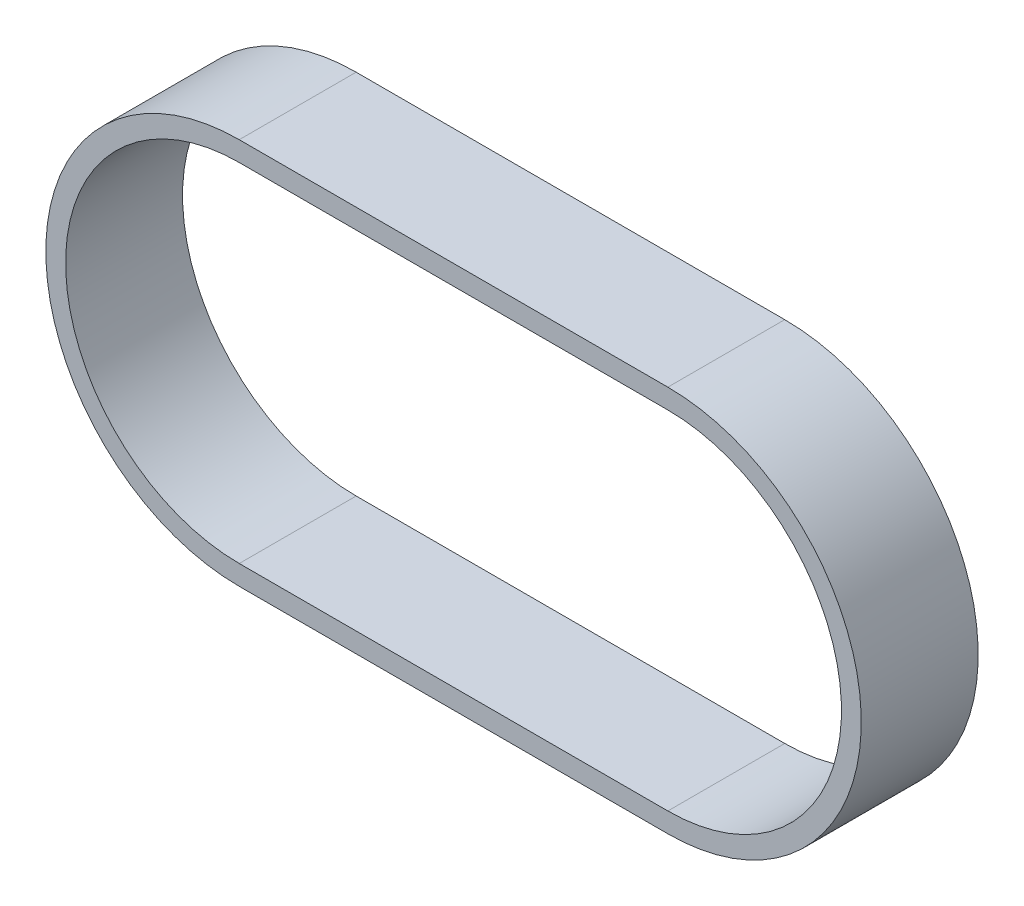
ISO-10303-21;
HEADER;
FILE_DESCRIPTION(('STEP AP214'),'2;1');
FILE_NAME('part.step','',(''),(''),'','','');
FILE_SCHEMA(('AUTOMOTIVE_DESIGN { 1 0 10303 214 1 1 1 1 }'));
ENDSEC;
DATA;
#1=APPLICATION_CONTEXT('core data for automotive mechanical design processes');
#2=APPLICATION_PROTOCOL_DEFINITION('international standard','automotive_design',2000,#1);
#3=PRODUCT_CONTEXT('',#1,'mechanical');
#4=PRODUCT('Part','Part','',(#3));
#5=PRODUCT_RELATED_PRODUCT_CATEGORY('part','',(#4));
#6=PRODUCT_DEFINITION_FORMATION('','',#4);
#7=PRODUCT_DEFINITION_CONTEXT('part definition',#1,'design');
#8=PRODUCT_DEFINITION('design','',#6,#7);
#9=PRODUCT_DEFINITION_SHAPE('','',#8);
#10=(LENGTH_UNIT() NAMED_UNIT(*) SI_UNIT(.MILLI.,.METRE.));
#11=(NAMED_UNIT(*) PLANE_ANGLE_UNIT() SI_UNIT($,.RADIAN.));
#12=(NAMED_UNIT(*) SI_UNIT($,.STERADIAN.) SOLID_ANGLE_UNIT());
#13=UNCERTAINTY_MEASURE_WITH_UNIT(LENGTH_MEASURE(1.E-05),#10,'distance_accuracy_value','');
#14=(GEOMETRIC_REPRESENTATION_CONTEXT(3) GLOBAL_UNCERTAINTY_ASSIGNED_CONTEXT((#13)) GLOBAL_UNIT_ASSIGNED_CONTEXT((#10,
#11,#12)) REPRESENTATION_CONTEXT('',''));
#15=CARTESIAN_POINT('',(0.,0.,0.));
#16=DIRECTION('',(0.,0.,1.));
#17=DIRECTION('',(1.,0.,0.));
#18=AXIS2_PLACEMENT_3D('',#15,#16,#17);
#19=CARTESIAN_POINT('',(0.,0.,15.));
#20=DIRECTION('',(0.,0.,-1.));
#21=DIRECTION('',(-1.,0.,0.));
#22=AXIS2_PLACEMENT_3D('',#19,#20,#21);
#23=PLANE('',#22);
#24=CARTESIAN_POINT('',(0.,0.,15.));
#25=DIRECTION('',(0.,0.,1.));
#26=DIRECTION('',(-1.,0.,0.));
#27=AXIS2_PLACEMENT_3D('',#24,#25,#26);
#28=CIRCLE('',#27,24.8158);
#29=CARTESIAN_POINT('',(0.,24.8158,15.));
#30=VERTEX_POINT('',#29);
#31=CARTESIAN_POINT('',(0.,-24.8158,15.));
#32=VERTEX_POINT('',#31);
#33=EDGE_CURVE('E140',#30,#32,#28,.T.);
#34=ORIENTED_EDGE('',*,*,#33,.T.);
#35=DIRECTION('',(1.,0.,0.));
#36=VECTOR('',#35,1.);
#37=CARTESIAN_POINT('',(54.991,-24.8158,15.));
#38=LINE('',#37,#36);
#39=CARTESIAN_POINT('',(54.991,-24.8158,15.));
#40=VERTEX_POINT('',#39);
#41=EDGE_CURVE('E143',#32,#40,#38,.T.);
#42=ORIENTED_EDGE('',*,*,#41,.T.);
#43=CARTESIAN_POINT('',(54.991,0.,15.));
#44=DIRECTION('',(0.,0.,1.));
#45=DIRECTION('',(1.,0.,0.));
#46=AXIS2_PLACEMENT_3D('',#43,#44,#45);
#47=CIRCLE('',#46,24.8158);
#48=CARTESIAN_POINT('',(54.991,24.8158,15.));
#49=VERTEX_POINT('',#48);
#50=EDGE_CURVE('E146',#40,#49,#47,.T.);
#51=ORIENTED_EDGE('',*,*,#50,.T.);
#52=DIRECTION('',(-1.,0.,0.));
#53=VECTOR('',#52,1.);
#54=CARTESIAN_POINT('',(0.,24.8158,15.));
#55=LINE('',#54,#53);
#56=EDGE_CURVE('E148',#49,#30,#55,.T.);
#57=ORIENTED_EDGE('',*,*,#56,.T.);
#58=EDGE_LOOP('',(#34,#42,#51,#57));
#59=FACE_BOUND('',#58,.T.);
#60=CARTESIAN_POINT('',(0.,0.,15.));
#61=DIRECTION('',(0.,0.,1.));
#62=DIRECTION('',(-1.,0.,0.));
#63=AXIS2_PLACEMENT_3D('',#60,#61,#62);
#64=CIRCLE('',#63,22.2758);
#65=CARTESIAN_POINT('',(0.,22.2758,15.));
#66=VERTEX_POINT('',#65);
#67=CARTESIAN_POINT('',(0.,-22.2758,15.));
#68=VERTEX_POINT('',#67);
#69=EDGE_CURVE('E104',#66,#68,#64,.T.);
#70=ORIENTED_EDGE('',*,*,#69,.F.);
#71=DIRECTION('',(-1.,0.,0.));
#72=VECTOR('',#71,1.);
#73=CARTESIAN_POINT('',(0.,22.2758,15.));
#74=LINE('',#73,#72);
#75=CARTESIAN_POINT('',(54.991,22.2758,15.));
#76=VERTEX_POINT('',#75);
#77=EDGE_CURVE('E126',#76,#66,#74,.T.);
#78=ORIENTED_EDGE('',*,*,#77,.F.);
#79=CARTESIAN_POINT('',(54.991,0.,15.));
#80=DIRECTION('',(0.,0.,1.));
#81=DIRECTION('',(1.,0.,0.));
#82=AXIS2_PLACEMENT_3D('',#79,#80,#81);
#83=CIRCLE('',#82,22.2758);
#84=CARTESIAN_POINT('',(54.991,-22.2758,15.));
#85=VERTEX_POINT('',#84);
#86=EDGE_CURVE('E124',#85,#76,#83,.T.);
#87=ORIENTED_EDGE('',*,*,#86,.F.);
#88=DIRECTION('',(1.,0.,0.));
#89=VECTOR('',#88,1.);
#90=CARTESIAN_POINT('',(54.991,-22.2758,15.));
#91=LINE('',#90,#89);
#92=EDGE_CURVE('E112',#68,#85,#91,.T.);
#93=ORIENTED_EDGE('',*,*,#92,.F.);
#94=EDGE_LOOP('',(#70,#78,#87,#93));
#95=FACE_BOUND('',#94,.T.);
#96=ADVANCED_FACE('F39',(#59,#95),#23,.F.);
#97=CARTESIAN_POINT('',(0.,0.,0.));
#98=DIRECTION('',(0.,0.,-1.));
#99=DIRECTION('',(-1.,0.,0.));
#100=AXIS2_PLACEMENT_3D('',#97,#98,#99);
#101=PLANE('',#100);
#102=CARTESIAN_POINT('',(0.,0.,0.));
#103=DIRECTION('',(0.,0.,1.));
#104=DIRECTION('',(-1.,0.,0.));
#105=AXIS2_PLACEMENT_3D('',#102,#103,#104);
#106=CIRCLE('',#105,24.8158);
#107=CARTESIAN_POINT('',(0.,24.8158,0.));
#108=VERTEX_POINT('',#107);
#109=CARTESIAN_POINT('',(0.,-24.8158,0.));
#110=VERTEX_POINT('',#109);
#111=EDGE_CURVE('E120',#108,#110,#106,.T.);
#112=ORIENTED_EDGE('',*,*,#111,.F.);
#113=DIRECTION('',(-1.,0.,0.));
#114=VECTOR('',#113,1.);
#115=CARTESIAN_POINT('',(0.,24.8158,0.));
#116=LINE('',#115,#114);
#117=CARTESIAN_POINT('',(54.991,24.8158,0.));
#118=VERTEX_POINT('',#117);
#119=EDGE_CURVE('E144',#118,#108,#116,.T.);
#120=ORIENTED_EDGE('',*,*,#119,.F.);
#121=CARTESIAN_POINT('',(54.991,0.,0.));
#122=DIRECTION('',(0.,0.,1.));
#123=DIRECTION('',(1.,0.,0.));
#124=AXIS2_PLACEMENT_3D('',#121,#122,#123);
#125=CIRCLE('',#124,24.8158);
#126=CARTESIAN_POINT('',(54.991,-24.8158,0.));
#127=VERTEX_POINT('',#126);
#128=EDGE_CURVE('E155',#127,#118,#125,.T.);
#129=ORIENTED_EDGE('',*,*,#128,.F.);
#130=DIRECTION('',(1.,0.,0.));
#131=VECTOR('',#130,1.);
#132=CARTESIAN_POINT('',(54.991,-24.8158,0.));
#133=LINE('',#132,#131);
#134=EDGE_CURVE('E153',#110,#127,#133,.T.);
#135=ORIENTED_EDGE('',*,*,#134,.F.);
#136=EDGE_LOOP('',(#112,#120,#129,#135));
#137=FACE_BOUND('',#136,.T.);
#138=DIRECTION('',(-1.,0.,0.));
#139=VECTOR('',#138,1.);
#140=CARTESIAN_POINT('',(0.,22.2758,0.));
#141=LINE('',#140,#139);
#142=CARTESIAN_POINT('',(54.991,22.2758,0.));
#143=VERTEX_POINT('',#142);
#144=CARTESIAN_POINT('',(0.,22.2758,0.));
#145=VERTEX_POINT('',#144);
#146=EDGE_CURVE('E113',#143,#145,#141,.T.);
#147=ORIENTED_EDGE('',*,*,#146,.T.);
#148=CARTESIAN_POINT('',(0.,0.,0.));
#149=DIRECTION('',(0.,0.,1.));
#150=DIRECTION('',(-1.,0.,0.));
#151=AXIS2_PLACEMENT_3D('',#148,#149,#150);
#152=CIRCLE('',#151,22.2758);
#153=CARTESIAN_POINT('',(0.,-22.2758,0.));
#154=VERTEX_POINT('',#153);
#155=EDGE_CURVE('E62',#145,#154,#152,.T.);
#156=ORIENTED_EDGE('',*,*,#155,.T.);
#157=DIRECTION('',(1.,0.,0.));
#158=VECTOR('',#157,1.);
#159=CARTESIAN_POINT('',(54.991,-22.2758,0.));
#160=LINE('',#159,#158);
#161=CARTESIAN_POINT('',(54.991,-22.2758,0.));
#162=VERTEX_POINT('',#161);
#163=EDGE_CURVE('E119',#154,#162,#160,.T.);
#164=ORIENTED_EDGE('',*,*,#163,.T.);
#165=CARTESIAN_POINT('',(54.991,0.,0.));
#166=DIRECTION('',(0.,0.,1.));
#167=DIRECTION('',(1.,0.,0.));
#168=AXIS2_PLACEMENT_3D('',#165,#166,#167);
#169=CIRCLE('',#168,22.2758);
#170=EDGE_CURVE('E132',#162,#143,#169,.T.);
#171=ORIENTED_EDGE('',*,*,#170,.T.);
#172=EDGE_LOOP('',(#147,#156,#164,#171));
#173=FACE_BOUND('',#172,.T.);
#174=ADVANCED_FACE('F173',(#137,#173),#101,.T.);
#175=CARTESIAN_POINT('',(0.,0.,15.));
#176=DIRECTION('',(0.,0.,-1.));
#177=DIRECTION('',(-1.,0.,0.));
#178=AXIS2_PLACEMENT_3D('',#175,#176,#177);
#179=CYLINDRICAL_SURFACE('',#178,24.8158);
#180=ORIENTED_EDGE('',*,*,#111,.T.);
#181=DIRECTION('',(0.,0.,-1.));
#182=VECTOR('',#181,1.);
#183=CARTESIAN_POINT('',(0.,-24.8158,15.));
#184=LINE('',#183,#182);
#185=EDGE_CURVE('E11',#32,#110,#184,.T.);
#186=ORIENTED_EDGE('',*,*,#185,.F.);
#187=ORIENTED_EDGE('',*,*,#33,.F.);
#188=DIRECTION('',(0.,0.,-1.));
#189=VECTOR('',#188,1.);
#190=CARTESIAN_POINT('',(0.,24.8158,15.));
#191=LINE('',#190,#189);
#192=EDGE_CURVE('E150',#30,#108,#191,.T.);
#193=ORIENTED_EDGE('',*,*,#192,.T.);
#194=EDGE_LOOP('',(#180,#186,#187,#193));
#195=FACE_BOUND('',#194,.T.);
#196=ADVANCED_FACE('F41',(#195),#179,.T.);
#197=CARTESIAN_POINT('',(54.991,-24.8158,15.));
#198=DIRECTION('',(0.,1.,0.));
#199=DIRECTION('',(0.,0.,1.));
#200=AXIS2_PLACEMENT_3D('',#197,#198,#199);
#201=PLANE('',#200);
#202=ORIENTED_EDGE('',*,*,#134,.T.);
#203=DIRECTION('',(0.,0.,-1.));
#204=VECTOR('',#203,1.);
#205=CARTESIAN_POINT('',(54.991,-24.8158,15.));
#206=LINE('',#205,#204);
#207=EDGE_CURVE('E47',#40,#127,#206,.T.);
#208=ORIENTED_EDGE('',*,*,#207,.F.);
#209=ORIENTED_EDGE('',*,*,#41,.F.);
#210=ORIENTED_EDGE('',*,*,#185,.T.);
#211=EDGE_LOOP('',(#202,#208,#209,#210));
#212=FACE_BOUND('',#211,.T.);
#213=ADVANCED_FACE('F183',(#212),#201,.F.);
#214=CARTESIAN_POINT('',(54.991,0.,15.));
#215=DIRECTION('',(0.,0.,-1.));
#216=DIRECTION('',(-1.,0.,0.));
#217=AXIS2_PLACEMENT_3D('',#214,#215,#216);
#218=CYLINDRICAL_SURFACE('',#217,24.8158);
#219=ORIENTED_EDGE('',*,*,#128,.T.);
#220=DIRECTION('',(0.,0.,-1.));
#221=VECTOR('',#220,1.);
#222=CARTESIAN_POINT('',(54.991,24.8158,15.));
#223=LINE('',#222,#221);
#224=EDGE_CURVE('E160',#49,#118,#223,.T.);
#225=ORIENTED_EDGE('',*,*,#224,.F.);
#226=ORIENTED_EDGE('',*,*,#50,.F.);
#227=ORIENTED_EDGE('',*,*,#207,.T.);
#228=EDGE_LOOP('',(#219,#225,#226,#227));
#229=FACE_BOUND('',#228,.T.);
#230=ADVANCED_FACE('F167',(#229),#218,.T.);
#231=CARTESIAN_POINT('',(0.,24.8158,15.));
#232=DIRECTION('',(0.,-1.,0.));
#233=DIRECTION('',(0.,0.,-1.));
#234=AXIS2_PLACEMENT_3D('',#231,#232,#233);
#235=PLANE('',#234);
#236=ORIENTED_EDGE('',*,*,#119,.T.);
#237=ORIENTED_EDGE('',*,*,#192,.F.);
#238=ORIENTED_EDGE('',*,*,#56,.F.);
#239=ORIENTED_EDGE('',*,*,#224,.T.);
#240=EDGE_LOOP('',(#236,#237,#238,#239));
#241=FACE_BOUND('',#240,.T.);
#242=ADVANCED_FACE('F177',(#241),#235,.F.);
#243=CARTESIAN_POINT('',(0.,0.,15.));
#244=DIRECTION('',(0.,0.,-1.));
#245=DIRECTION('',(-1.,0.,0.));
#246=AXIS2_PLACEMENT_3D('',#243,#244,#245);
#247=CYLINDRICAL_SURFACE('',#246,22.2758);
#248=ORIENTED_EDGE('',*,*,#155,.F.);
#249=DIRECTION('',(0.,0.,-1.));
#250=VECTOR('',#249,1.);
#251=CARTESIAN_POINT('',(0.,22.2758,15.));
#252=LINE('',#251,#250);
#253=EDGE_CURVE('E108',#66,#145,#252,.T.);
#254=ORIENTED_EDGE('',*,*,#253,.F.);
#255=ORIENTED_EDGE('',*,*,#69,.T.);
#256=DIRECTION('',(0.,0.,-1.));
#257=VECTOR('',#256,1.);
#258=CARTESIAN_POINT('',(0.,-22.2758,15.));
#259=LINE('',#258,#257);
#260=EDGE_CURVE('E107',#68,#154,#259,.T.);
#261=ORIENTED_EDGE('',*,*,#260,.T.);
#262=EDGE_LOOP('',(#248,#254,#255,#261));
#263=FACE_BOUND('',#262,.T.);
#264=ADVANCED_FACE('F106',(#263),#247,.F.);
#265=CARTESIAN_POINT('',(54.991,-22.2758,15.));
#266=DIRECTION('',(0.,1.,0.));
#267=DIRECTION('',(-1.,0.,0.));
#268=AXIS2_PLACEMENT_3D('',#265,#266,#267);
#269=PLANE('',#268);
#270=ORIENTED_EDGE('',*,*,#163,.F.);
#271=ORIENTED_EDGE('',*,*,#260,.F.);
#272=ORIENTED_EDGE('',*,*,#92,.T.);
#273=DIRECTION('',(0.,0.,-1.));
#274=VECTOR('',#273,1.);
#275=CARTESIAN_POINT('',(54.991,-22.2758,15.));
#276=LINE('',#275,#274);
#277=EDGE_CURVE('E121',#85,#162,#276,.T.);
#278=ORIENTED_EDGE('',*,*,#277,.T.);
#279=EDGE_LOOP('',(#270,#271,#272,#278));
#280=FACE_BOUND('',#279,.T.);
#281=ADVANCED_FACE('F116',(#280),#269,.T.);
#282=CARTESIAN_POINT('',(54.991,0.,15.));
#283=DIRECTION('',(0.,0.,-1.));
#284=DIRECTION('',(-1.,0.,0.));
#285=AXIS2_PLACEMENT_3D('',#282,#283,#284);
#286=CYLINDRICAL_SURFACE('',#285,22.2758);
#287=ORIENTED_EDGE('',*,*,#170,.F.);
#288=ORIENTED_EDGE('',*,*,#277,.F.);
#289=ORIENTED_EDGE('',*,*,#86,.T.);
#290=DIRECTION('',(0.,0.,-1.));
#291=VECTOR('',#290,1.);
#292=CARTESIAN_POINT('',(54.991,22.2758,15.));
#293=LINE('',#292,#291);
#294=EDGE_CURVE('E54',#76,#143,#293,.T.);
#295=ORIENTED_EDGE('',*,*,#294,.T.);
#296=EDGE_LOOP('',(#287,#288,#289,#295));
#297=FACE_BOUND('',#296,.T.);
#298=ADVANCED_FACE('F206',(#297),#286,.F.);
#299=CARTESIAN_POINT('',(0.,22.2758,15.));
#300=DIRECTION('',(0.,-1.,0.));
#301=DIRECTION('',(1.,0.,0.));
#302=AXIS2_PLACEMENT_3D('',#299,#300,#301);
#303=PLANE('',#302);
#304=ORIENTED_EDGE('',*,*,#146,.F.);
#305=ORIENTED_EDGE('',*,*,#294,.F.);
#306=ORIENTED_EDGE('',*,*,#77,.T.);
#307=ORIENTED_EDGE('',*,*,#253,.T.);
#308=EDGE_LOOP('',(#304,#305,#306,#307));
#309=FACE_BOUND('',#308,.T.);
#310=ADVANCED_FACE('F210',(#309),#303,.T.);
#311=CLOSED_SHELL('',(#96,#174,#196,#213,#230,#242,#264,#281,#298,#310));
#312=MANIFOLD_SOLID_BREP('B2',#311);
#313=ADVANCED_BREP_SHAPE_REPRESENTATION('',(#18,#312),#14);
#314=SHAPE_DEFINITION_REPRESENTATION(#9,#313);
ENDSEC;
END-ISO-10303-21;
